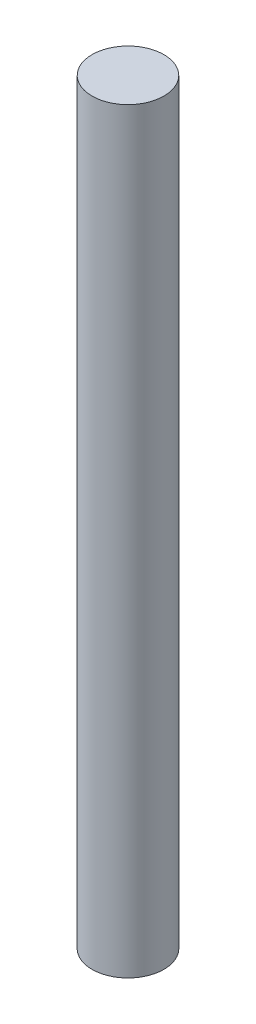
ISO-10303-21;
HEADER;
FILE_DESCRIPTION(('STEP AP214'),'2;1');
FILE_NAME('part.step','',(''),(''),'','','');
FILE_SCHEMA(('AUTOMOTIVE_DESIGN { 1 0 10303 214 1 1 1 1 }'));
ENDSEC;
DATA;
#1=APPLICATION_CONTEXT('core data for automotive mechanical design processes');
#2=APPLICATION_PROTOCOL_DEFINITION('international standard','automotive_design',2000,#1);
#3=PRODUCT_CONTEXT('',#1,'mechanical');
#4=PRODUCT('Part','Part','',(#3));
#5=PRODUCT_RELATED_PRODUCT_CATEGORY('part','',(#4));
#6=PRODUCT_DEFINITION_FORMATION('','',#4);
#7=PRODUCT_DEFINITION_CONTEXT('part definition',#1,'design');
#8=PRODUCT_DEFINITION('design','',#6,#7);
#9=PRODUCT_DEFINITION_SHAPE('','',#8);
#10=(LENGTH_UNIT() NAMED_UNIT(*) SI_UNIT(.MILLI.,.METRE.));
#11=(NAMED_UNIT(*) PLANE_ANGLE_UNIT() SI_UNIT($,.RADIAN.));
#12=(NAMED_UNIT(*) SI_UNIT($,.STERADIAN.) SOLID_ANGLE_UNIT());
#13=UNCERTAINTY_MEASURE_WITH_UNIT(LENGTH_MEASURE(1.E-05),#10,'distance_accuracy_value','');
#14=(GEOMETRIC_REPRESENTATION_CONTEXT(3) GLOBAL_UNCERTAINTY_ASSIGNED_CONTEXT((#13)) GLOBAL_UNIT_ASSIGNED_CONTEXT((#10,
#11,#12)) REPRESENTATION_CONTEXT('',''));
#15=CARTESIAN_POINT('',(0.,0.,0.));
#16=DIRECTION('',(0.,0.,1.));
#17=DIRECTION('',(1.,0.,0.));
#18=AXIS2_PLACEMENT_3D('',#15,#16,#17);
#19=CARTESIAN_POINT('',(0.,100.,0.));
#20=DIRECTION('',(0.,-1.,0.));
#21=DIRECTION('',(0.,0.,-1.));
#22=AXIS2_PLACEMENT_3D('',#19,#20,#21);
#23=CYLINDRICAL_SURFACE('',#22,4.75);
#24=CARTESIAN_POINT('',(0.,100.,0.));
#25=DIRECTION('',(0.,1.,0.));
#26=DIRECTION('',(0.,0.,1.));
#27=AXIS2_PLACEMENT_3D('',#24,#25,#26);
#28=CIRCLE('',#27,4.75);
#29=CARTESIAN_POINT('',(0.,100.,4.75));
#30=VERTEX_POINT('',#29);
#31=EDGE_CURVE('E10',#30,#30,#28,.T.);
#32=ORIENTED_EDGE('',*,*,#31,.F.);
#33=EDGE_LOOP('',(#32));
#34=FACE_BOUND('',#33,.T.);
#35=CARTESIAN_POINT('',(0.,0.,0.));
#36=DIRECTION('',(0.,1.,0.));
#37=DIRECTION('',(0.,0.,1.));
#38=AXIS2_PLACEMENT_3D('',#35,#36,#37);
#39=CIRCLE('',#38,4.75);
#40=CARTESIAN_POINT('',(0.,0.,4.75));
#41=VERTEX_POINT('',#40);
#42=EDGE_CURVE('E34',#41,#41,#39,.T.);
#43=ORIENTED_EDGE('',*,*,#42,.T.);
#44=EDGE_LOOP('',(#43));
#45=FACE_BOUND('',#44,.T.);
#46=ADVANCED_FACE('F31',(#34,#45),#23,.T.);
#47=CARTESIAN_POINT('',(0.,100.,0.));
#48=DIRECTION('',(0.,1.,0.));
#49=DIRECTION('',(0.,0.,1.));
#50=AXIS2_PLACEMENT_3D('',#47,#48,#49);
#51=PLANE('',#50);
#52=ORIENTED_EDGE('',*,*,#31,.T.);
#53=EDGE_LOOP('',(#52));
#54=FACE_BOUND('',#53,.T.);
#55=ADVANCED_FACE('F46',(#54),#51,.T.);
#56=CARTESIAN_POINT('',(0.,0.,0.));
#57=DIRECTION('',(0.,1.,0.));
#58=DIRECTION('',(0.,0.,1.));
#59=AXIS2_PLACEMENT_3D('',#56,#57,#58);
#60=PLANE('',#59);
#61=ORIENTED_EDGE('',*,*,#42,.F.);
#62=EDGE_LOOP('',(#61));
#63=FACE_BOUND('',#62,.T.);
#64=ADVANCED_FACE('F44',(#63),#60,.F.);
#65=CLOSED_SHELL('',(#46,#55,#64));
#66=MANIFOLD_SOLID_BREP('B2',#65);
#67=ADVANCED_BREP_SHAPE_REPRESENTATION('',(#18,#66),#14);
#68=SHAPE_DEFINITION_REPRESENTATION(#9,#67);
ENDSEC;
END-ISO-10303-21;
